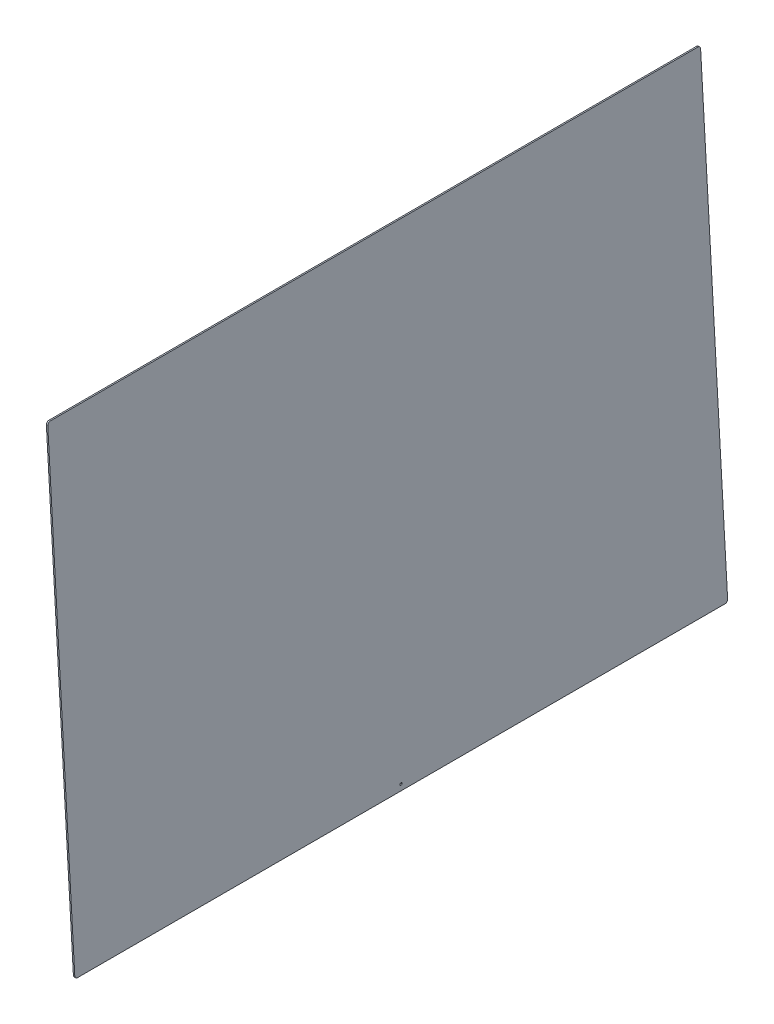
ISO-10303-21;
HEADER;
FILE_DESCRIPTION(('STEP AP214'),'2;1');
FILE_NAME('part.step','',(''),(''),'','','');
FILE_SCHEMA(('AUTOMOTIVE_DESIGN { 1 0 10303 214 1 1 1 1 }'));
ENDSEC;
DATA;
#1=APPLICATION_CONTEXT('core data for automotive mechanical design processes');
#2=APPLICATION_PROTOCOL_DEFINITION('international standard','automotive_design',2000,#1);
#3=PRODUCT_CONTEXT('',#1,'mechanical');
#4=PRODUCT('Part','Part','',(#3));
#5=PRODUCT_RELATED_PRODUCT_CATEGORY('part','',(#4));
#6=PRODUCT_DEFINITION_FORMATION('','',#4);
#7=PRODUCT_DEFINITION_CONTEXT('part definition',#1,'design');
#8=PRODUCT_DEFINITION('design','',#6,#7);
#9=PRODUCT_DEFINITION_SHAPE('','',#8);
#10=(LENGTH_UNIT() NAMED_UNIT(*) SI_UNIT(.MILLI.,.METRE.));
#11=(NAMED_UNIT(*) PLANE_ANGLE_UNIT() SI_UNIT($,.RADIAN.));
#12=(NAMED_UNIT(*) SI_UNIT($,.STERADIAN.) SOLID_ANGLE_UNIT());
#13=UNCERTAINTY_MEASURE_WITH_UNIT(LENGTH_MEASURE(1.E-05),#10,'distance_accuracy_value','');
#14=(GEOMETRIC_REPRESENTATION_CONTEXT(3) GLOBAL_UNCERTAINTY_ASSIGNED_CONTEXT((#13)) GLOBAL_UNIT_ASSIGNED_CONTEXT((#10,
#11,#12)) REPRESENTATION_CONTEXT('',''));
#15=CARTESIAN_POINT('',(0.,0.,0.));
#16=DIRECTION('',(0.,0.,1.));
#17=DIRECTION('',(1.,0.,0.));
#18=AXIS2_PLACEMENT_3D('',#15,#16,#17);
#19=CARTESIAN_POINT('',(-765.372851251011,-171.531638732564,-133.95));
#20=DIRECTION('',(0.998302940921257,0.0582343382204067,0.));
#21=DIRECTION('',(-0.0582343382204067,0.998302940921257,0.));
#22=AXIS2_PLACEMENT_3D('',#19,#20,#21);
#23=PLANE('',#22);
#24=CARTESIAN_POINT('',(-766.246366324317,-156.557094618745,237.3));
#25=DIRECTION('',(0.998302940921257,0.0582343382204067,0.));
#26=DIRECTION('',(-0.0582343382204067,0.998302940921257,0.));
#27=AXIS2_PLACEMENT_3D('',#24,#25,#26);
#28=CIRCLE('',#27,3.);
#29=CARTESIAN_POINT('',(-766.246366324317,-156.557094618745,240.3));
#30=VERTEX_POINT('',#29);
#31=CARTESIAN_POINT('',(-766.071663309656,-159.552003441509,237.3));
#32=VERTEX_POINT('',#31);
#33=EDGE_CURVE('E135',#30,#32,#28,.T.);
#34=ORIENTED_EDGE('',*,*,#33,.F.);
#35=DIRECTION('',(-0.0582343382204077,0.998302940921257,0.));
#36=VECTOR('',#35,1.);
#37=CARTESIAN_POINT('',(-766.246366324317,-156.557094618745,240.3));
#38=LINE('',#37,#36);
#39=CARTESIAN_POINT('',(-797.227034257574,374.540069951364,240.3));
#40=VERTEX_POINT('',#39);
#41=EDGE_CURVE('E116',#30,#40,#38,.T.);
#42=ORIENTED_EDGE('',*,*,#41,.T.);
#43=CARTESIAN_POINT('',(-797.227034257574,374.540069951364,237.3));
#44=DIRECTION('',(-0.998302940921257,-0.0582343382204067,0.));
#45=DIRECTION('',(0.0582343382204067,-0.998302940921257,0.));
#46=AXIS2_PLACEMENT_3D('',#43,#44,#45);
#47=CIRCLE('',#46,3.);
#48=CARTESIAN_POINT('',(-797.401737272235,377.534978774128,237.3));
#49=VERTEX_POINT('',#48);
#50=EDGE_CURVE('E119',#49,#40,#47,.F.);
#51=ORIENTED_EDGE('',*,*,#50,.F.);
#52=DIRECTION('',(0.,0.,1.));
#53=VECTOR('',#52,1.);
#54=CARTESIAN_POINT('',(-797.401737272235,377.534978774127,244.3));
#55=LINE('',#54,#53);
#56=CARTESIAN_POINT('',(-797.401737272235,377.534978774127,-505.2));
#57=VERTEX_POINT('',#56);
#58=EDGE_CURVE('E120',#49,#57,#55,.F.);
#59=ORIENTED_EDGE('',*,*,#58,.T.);
#60=CARTESIAN_POINT('',(-797.227034257574,374.540069951364,-505.2));
#61=DIRECTION('',(0.998302940921257,0.0582343382204067,0.));
#62=DIRECTION('',(-0.0582343382204067,0.998302940921257,0.));
#63=AXIS2_PLACEMENT_3D('',#60,#61,#62);
#64=CIRCLE('',#63,3.);
#65=CARTESIAN_POINT('',(-797.227034257574,374.540069951364,-508.2));
#66=VERTEX_POINT('',#65);
#67=EDGE_CURVE('E89',#66,#57,#64,.T.);
#68=ORIENTED_EDGE('',*,*,#67,.F.);
#69=DIRECTION('',(0.0582343382204077,-0.998302940921257,0.));
#70=VECTOR('',#69,1.);
#71=CARTESIAN_POINT('',(-797.227034257574,374.540069951364,-508.2));
#72=LINE('',#71,#70);
#73=CARTESIAN_POINT('',(-766.246366324317,-156.557094618745,-508.2));
#74=VERTEX_POINT('',#73);
#75=EDGE_CURVE('E82',#66,#74,#72,.T.);
#76=ORIENTED_EDGE('',*,*,#75,.T.);
#77=CARTESIAN_POINT('',(-766.246366324317,-156.557094618745,-505.2));
#78=DIRECTION('',(-0.998302940921257,-0.0582343382204067,0.));
#79=DIRECTION('',(0.0582343382204067,-0.998302940921257,0.));
#80=AXIS2_PLACEMENT_3D('',#77,#78,#79);
#81=CIRCLE('',#80,3.);
#82=CARTESIAN_POINT('',(-766.071663309656,-159.552003441509,-505.2));
#83=VERTEX_POINT('',#82);
#84=EDGE_CURVE('E86',#83,#74,#81,.F.);
#85=ORIENTED_EDGE('',*,*,#84,.F.);
#86=DIRECTION('',(0.,0.,1.));
#87=VECTOR('',#86,1.);
#88=CARTESIAN_POINT('',(-766.071663309656,-159.552003441509,-512.2));
#89=LINE('',#88,#87);
#90=EDGE_CURVE('E77',#83,#32,#89,.T.);
#91=ORIENTED_EDGE('',*,*,#90,.T.);
#92=EDGE_LOOP('',(#34,#42,#51,#59,#68,#76,#85,#91));
#93=FACE_BOUND('',#92,.T.);
#94=CARTESIAN_POINT('',(-766.445680703539,-153.140276689458,-133.95));
#95=DIRECTION('',(-0.998302940921255,-0.058234338220455,0.));
#96=DIRECTION('',(0.058234338220455,-0.998302940921255,0.));
#97=AXIS2_PLACEMENT_3D('',#94,#95,#96);
#98=CIRCLE('',#97,1.69999999999829);
#99=CARTESIAN_POINT('',(-766.346682328565,-154.837391689023,-133.95));
#100=VERTEX_POINT('',#99);
#101=EDGE_CURVE('E19',#100,#100,#98,.F.);
#102=ORIENTED_EDGE('',*,*,#101,.T.);
#103=EDGE_LOOP('',(#102));
#104=FACE_BOUND('',#103,.T.);
#105=ADVANCED_FACE('F16',(#93,#104),#23,.F.);
#106=CARTESIAN_POINT('',(-766.445680703441,-153.140276689452,-133.95));
#107=DIRECTION('',(-0.998302940921255,-0.058234338220455,0.));
#108=DIRECTION('',(0.058234338220455,-0.998302940921255,0.));
#109=AXIS2_PLACEMENT_3D('',#106,#107,#108);
#110=CONICAL_SURFACE('',#109,1.69999999982776,1.04719755122202);
#111=CARTESIAN_POINT('',(-766.186313991273,-153.125146964576,-133.95));
#112=DIRECTION('',(-0.998302940921257,-0.0582343382204067,0.));
#113=DIRECTION('',(0.0582343382204067,-0.998302940921257,0.));
#114=AXIS2_PLACEMENT_3D('',#111,#112,#113);
#115=CIRCLE('',#114,1.25);
#116=CARTESIAN_POINT('',(-766.113521068497,-154.373025640727,-133.95));
#117=VERTEX_POINT('',#116);
#118=EDGE_CURVE('E110',#117,#117,#115,.F.);
#119=ORIENTED_EDGE('',*,*,#118,.T.);
#120=EDGE_LOOP('',(#119));
#121=FACE_BOUND('',#120,.T.);
#122=ORIENTED_EDGE('',*,*,#101,.F.);
#123=EDGE_LOOP('',(#122));
#124=FACE_BOUND('',#123,.T.);
#125=ADVANCED_FACE('F173',(#121,#124),#110,.F.);
#126=CARTESIAN_POINT('',(-764.474378604182,-159.458828500356,-512.2));
#127=DIRECTION('',(-0.0582343382204067,0.998302940921257,0.));
#128=DIRECTION('',(-0.998302940921257,-0.0582343382204067,0.));
#129=AXIS2_PLACEMENT_3D('',#126,#127,#128);
#130=PLANE('',#129);
#131=DIRECTION('',(-0.998302940921257,-0.0582343382204067,0.));
#132=VECTOR('',#131,1.);
#133=CARTESIAN_POINT('',(-764.474378604182,-159.458828500356,-505.2));
#134=LINE('',#133,#132);
#135=CARTESIAN_POINT('',(-764.474378604182,-159.458828500356,-505.2));
#136=VERTEX_POINT('',#135);
#137=EDGE_CURVE('E99',#136,#83,#134,.T.);
#138=ORIENTED_EDGE('',*,*,#137,.F.);
#139=DIRECTION('',(0.,0.,1.));
#140=VECTOR('',#139,1.);
#141=CARTESIAN_POINT('',(-764.474378604182,-159.458828500356,-133.95));
#142=LINE('',#141,#140);
#143=CARTESIAN_POINT('',(-764.474378604182,-159.458828500356,237.3));
#144=VERTEX_POINT('',#143);
#145=EDGE_CURVE('E113',#144,#136,#142,.F.);
#146=ORIENTED_EDGE('',*,*,#145,.F.);
#147=DIRECTION('',(0.998302940921257,0.0582343382204067,0.));
#148=VECTOR('',#147,1.);
#149=CARTESIAN_POINT('',(-764.474378604182,-159.458828500356,237.3));
#150=LINE('',#149,#148);
#151=EDGE_CURVE('E114',#32,#144,#150,.T.);
#152=ORIENTED_EDGE('',*,*,#151,.F.);
#153=ORIENTED_EDGE('',*,*,#90,.F.);
#154=EDGE_LOOP('',(#138,#146,#152,#153));
#155=FACE_BOUND('',#154,.T.);
#156=ADVANCED_FACE('F171',(#155),#130,.F.);
#157=CARTESIAN_POINT('',(-764.649081618843,-156.463919677592,-505.2));
#158=DIRECTION('',(-0.998302940921257,-0.0582343382204067,0.));
#159=DIRECTION('',(0.0582343382204067,-0.998302940921257,0.));
#160=AXIS2_PLACEMENT_3D('',#157,#158,#159);
#161=CYLINDRICAL_SURFACE('',#160,3.);
#162=ORIENTED_EDGE('',*,*,#137,.T.);
#163=ORIENTED_EDGE('',*,*,#84,.T.);
#164=DIRECTION('',(0.998302940921248,0.0582343382205611,0.));
#165=VECTOR('',#164,1.);
#166=CARTESIAN_POINT('',(-766.246366324317,-156.557094618745,-508.2));
#167=LINE('',#166,#165);
#168=CARTESIAN_POINT('',(-764.649081618843,-156.463919677592,-508.2));
#169=VERTEX_POINT('',#168);
#170=EDGE_CURVE('E93',#74,#169,#167,.T.);
#171=ORIENTED_EDGE('',*,*,#170,.T.);
#172=CARTESIAN_POINT('',(-764.649081618843,-156.463919677592,-505.2));
#173=DIRECTION('',(-0.998302940921257,-0.0582343382204067,0.));
#174=DIRECTION('',(0.0582343382204067,-0.998302940921257,0.));
#175=AXIS2_PLACEMENT_3D('',#172,#173,#174);
#176=CIRCLE('',#175,3.);
#177=EDGE_CURVE('E133',#136,#169,#176,.F.);
#178=ORIENTED_EDGE('',*,*,#177,.F.);
#179=EDGE_LOOP('',(#162,#163,#171,#178));
#180=FACE_BOUND('',#179,.T.);
#181=ADVANCED_FACE('F96',(#180),#161,.T.);
#182=CARTESIAN_POINT('',(-796.386795948965,387.611183124493,-508.2));
#183=DIRECTION('',(0.,0.,1.));
#184=DIRECTION('',(1.,0.,0.));
#185=AXIS2_PLACEMENT_3D('',#182,#183,#184);
#186=PLANE('',#185);
#187=ORIENTED_EDGE('',*,*,#75,.F.);
#188=DIRECTION('',(0.998302940921257,0.0582343382204067,0.));
#189=VECTOR('',#188,1.);
#190=CARTESIAN_POINT('',(-795.6297495521,374.633244892517,-508.2));
#191=LINE('',#190,#189);
#192=CARTESIAN_POINT('',(-795.6297495521,374.633244892517,-508.2));
#193=VERTEX_POINT('',#192);
#194=EDGE_CURVE('E104',#193,#66,#191,.F.);
#195=ORIENTED_EDGE('',*,*,#194,.F.);
#196=DIRECTION('',(-0.0582343382204067,0.998302940921257,0.));
#197=VECTOR('',#196,1.);
#198=CARTESIAN_POINT('',(-763.775566545537,-171.438463791411,-508.2));
#199=LINE('',#198,#197);
#200=EDGE_CURVE('E102',#169,#193,#199,.T.);
#201=ORIENTED_EDGE('',*,*,#200,.F.);
#202=ORIENTED_EDGE('',*,*,#170,.F.);
#203=EDGE_LOOP('',(#187,#195,#201,#202));
#204=FACE_BOUND('',#203,.T.);
#205=ADVANCED_FACE('F100',(#204),#186,.F.);
#206=CARTESIAN_POINT('',(-795.6297495521,374.633244892517,-505.2));
#207=DIRECTION('',(0.998302940921257,0.0582343382204067,0.));
#208=DIRECTION('',(-0.0582343382204067,0.998302940921257,0.));
#209=AXIS2_PLACEMENT_3D('',#206,#207,#208);
#210=CYLINDRICAL_SURFACE('',#209,3.);
#211=DIRECTION('',(0.998302940921257,0.0582343382204067,0.));
#212=VECTOR('',#211,1.);
#213=CARTESIAN_POINT('',(-795.804452566761,377.62815371528,-505.2));
#214=LINE('',#213,#212);
#215=CARTESIAN_POINT('',(-795.804452566761,377.62815371528,-505.2));
#216=VERTEX_POINT('',#215);
#217=EDGE_CURVE('E121',#57,#216,#214,.T.);
#218=ORIENTED_EDGE('',*,*,#217,.T.);
#219=CARTESIAN_POINT('',(-795.6297495521,374.633244892517,-505.2));
#220=DIRECTION('',(0.998302940921257,0.0582343382204067,0.));
#221=DIRECTION('',(-0.0582343382204067,0.998302940921257,0.));
#222=AXIS2_PLACEMENT_3D('',#219,#220,#221);
#223=CIRCLE('',#222,3.);
#224=EDGE_CURVE('E130',#193,#216,#223,.T.);
#225=ORIENTED_EDGE('',*,*,#224,.F.);
#226=ORIENTED_EDGE('',*,*,#194,.T.);
#227=ORIENTED_EDGE('',*,*,#67,.T.);
#228=EDGE_LOOP('',(#218,#225,#226,#227));
#229=FACE_BOUND('',#228,.T.);
#230=ADVANCED_FACE('F143',(#229),#210,.T.);
#231=CARTESIAN_POINT('',(-795.804452566761,377.62815371528,244.3));
#232=DIRECTION('',(0.0582343382204067,-0.998302940921257,0.));
#233=DIRECTION('',(0.998302940921257,0.0582343382204067,0.));
#234=AXIS2_PLACEMENT_3D('',#231,#232,#233);
#235=PLANE('',#234);
#236=ORIENTED_EDGE('',*,*,#217,.F.);
#237=ORIENTED_EDGE('',*,*,#58,.F.);
#238=DIRECTION('',(-0.998302940921257,-0.0582343382204067,0.));
#239=VECTOR('',#238,1.);
#240=CARTESIAN_POINT('',(-795.804452566761,377.628153715281,237.3));
#241=LINE('',#240,#239);
#242=CARTESIAN_POINT('',(-795.804452566761,377.62815371528,237.3));
#243=VERTEX_POINT('',#242);
#244=EDGE_CURVE('E140',#243,#49,#241,.T.);
#245=ORIENTED_EDGE('',*,*,#244,.F.);
#246=DIRECTION('',(0.,0.,1.));
#247=VECTOR('',#246,1.);
#248=CARTESIAN_POINT('',(-795.804452566761,377.62815371528,-133.95));
#249=LINE('',#248,#247);
#250=EDGE_CURVE('E129',#216,#243,#249,.T.);
#251=ORIENTED_EDGE('',*,*,#250,.F.);
#252=EDGE_LOOP('',(#236,#237,#245,#251));
#253=FACE_BOUND('',#252,.T.);
#254=ADVANCED_FACE('F147',(#253),#235,.F.);
#255=CARTESIAN_POINT('',(-795.6297495521,374.633244892517,237.3));
#256=DIRECTION('',(-0.998302940921257,-0.0582343382204067,0.));
#257=DIRECTION('',(0.0582343382204067,-0.998302940921257,0.));
#258=AXIS2_PLACEMENT_3D('',#255,#256,#257);
#259=CYLINDRICAL_SURFACE('',#258,3.);
#260=ORIENTED_EDGE('',*,*,#244,.T.);
#261=ORIENTED_EDGE('',*,*,#50,.T.);
#262=DIRECTION('',(0.998302940921244,0.0582343382206343,0.));
#263=VECTOR('',#262,1.);
#264=CARTESIAN_POINT('',(-797.227034257574,374.540069951364,240.3));
#265=LINE('',#264,#263);
#266=CARTESIAN_POINT('',(-795.6297495521,374.633244892517,240.3));
#267=VERTEX_POINT('',#266);
#268=EDGE_CURVE('E118',#40,#267,#265,.T.);
#269=ORIENTED_EDGE('',*,*,#268,.T.);
#270=CARTESIAN_POINT('',(-795.6297495521,374.633244892517,237.3));
#271=DIRECTION('',(-0.998302940921257,-0.0582343382204067,0.));
#272=DIRECTION('',(0.0582343382204067,-0.998302940921257,0.));
#273=AXIS2_PLACEMENT_3D('',#270,#271,#272);
#274=CIRCLE('',#273,3.);
#275=EDGE_CURVE('E126',#243,#267,#274,.F.);
#276=ORIENTED_EDGE('',*,*,#275,.F.);
#277=EDGE_LOOP('',(#260,#261,#269,#276));
#278=FACE_BOUND('',#277,.T.);
#279=ADVANCED_FACE('F168',(#278),#259,.T.);
#280=CARTESIAN_POINT('',(-762.902051472231,-186.41300790523,240.3));
#281=DIRECTION('',(0.,0.,-1.));
#282=DIRECTION('',(-1.,0.,0.));
#283=AXIS2_PLACEMENT_3D('',#280,#281,#282);
#284=PLANE('',#283);
#285=DIRECTION('',(-0.0582343382204067,0.998302940921257,0.));
#286=VECTOR('',#285,1.);
#287=CARTESIAN_POINT('',(-763.775566545537,-171.438463791411,240.3));
#288=LINE('',#287,#286);
#289=CARTESIAN_POINT('',(-764.649081618843,-156.463919677592,240.3));
#290=VERTEX_POINT('',#289);
#291=EDGE_CURVE('E125',#267,#290,#288,.F.);
#292=ORIENTED_EDGE('',*,*,#291,.F.);
#293=ORIENTED_EDGE('',*,*,#268,.F.);
#294=ORIENTED_EDGE('',*,*,#41,.F.);
#295=DIRECTION('',(0.998302940921257,0.0582343382204067,0.));
#296=VECTOR('',#295,1.);
#297=CARTESIAN_POINT('',(-764.649081618843,-156.463919677592,240.3));
#298=LINE('',#297,#296);
#299=EDGE_CURVE('E34',#290,#30,#298,.F.);
#300=ORIENTED_EDGE('',*,*,#299,.F.);
#301=EDGE_LOOP('',(#292,#293,#294,#300));
#302=FACE_BOUND('',#301,.T.);
#303=ADVANCED_FACE('F166',(#302),#284,.F.);
#304=CARTESIAN_POINT('',(-764.649081618843,-156.463919677592,237.3));
#305=DIRECTION('',(0.998302940921257,0.0582343382204067,0.));
#306=DIRECTION('',(-0.0582343382204067,0.998302940921257,0.));
#307=AXIS2_PLACEMENT_3D('',#304,#305,#306);
#308=CYLINDRICAL_SURFACE('',#307,3.);
#309=ORIENTED_EDGE('',*,*,#151,.T.);
#310=CARTESIAN_POINT('',(-764.649081618843,-156.463919677592,237.3));
#311=DIRECTION('',(0.998302940921257,0.0582343382204067,0.));
#312=DIRECTION('',(-0.0582343382204067,0.998302940921257,0.));
#313=AXIS2_PLACEMENT_3D('',#310,#311,#312);
#314=CIRCLE('',#313,3.);
#315=EDGE_CURVE('E25',#290,#144,#314,.T.);
#316=ORIENTED_EDGE('',*,*,#315,.F.);
#317=ORIENTED_EDGE('',*,*,#299,.T.);
#318=ORIENTED_EDGE('',*,*,#33,.T.);
#319=EDGE_LOOP('',(#309,#316,#317,#318));
#320=FACE_BOUND('',#319,.T.);
#321=ADVANCED_FACE('F170',(#320),#308,.T.);
#322=CARTESIAN_POINT('',(-766.445680703526,-153.140276689457,-133.95));
#323=DIRECTION('',(-0.998302940921257,-0.0582343382204067,0.));
#324=DIRECTION('',(0.0582343382204067,-0.998302940921257,0.));
#325=AXIS2_PLACEMENT_3D('',#322,#323,#324);
#326=CYLINDRICAL_SURFACE('',#325,1.25);
#327=CARTESIAN_POINT('',(-764.848395998052,-153.047101748304,-133.95));
#328=DIRECTION('',(-0.998302940921257,-0.0582343382204067,0.));
#329=DIRECTION('',(0.0582343382204067,-0.998302940921257,0.));
#330=AXIS2_PLACEMENT_3D('',#327,#328,#329);
#331=CIRCLE('',#330,1.25);
#332=CARTESIAN_POINT('',(-764.775603075276,-154.294980424456,-133.95));
#333=VERTEX_POINT('',#332);
#334=EDGE_CURVE('E11',#333,#333,#331,.T.);
#335=ORIENTED_EDGE('',*,*,#334,.F.);
#336=EDGE_LOOP('',(#335));
#337=FACE_BOUND('',#336,.T.);
#338=ORIENTED_EDGE('',*,*,#118,.F.);
#339=EDGE_LOOP('',(#338));
#340=FACE_BOUND('',#339,.T.);
#341=ADVANCED_FACE('F183',(#337,#340),#326,.F.);
#342=CARTESIAN_POINT('',(-763.775566545537,-171.438463791411,-133.95));
#343=DIRECTION('',(0.998302940921257,0.0582343382204067,0.));
#344=DIRECTION('',(-0.0582343382204067,0.998302940921257,0.));
#345=AXIS2_PLACEMENT_3D('',#342,#343,#344);
#346=PLANE('',#345);
#347=ORIENTED_EDGE('',*,*,#334,.T.);
#348=EDGE_LOOP('',(#347));
#349=FACE_BOUND('',#348,.T.);
#350=ORIENTED_EDGE('',*,*,#291,.T.);
#351=ORIENTED_EDGE('',*,*,#315,.T.);
#352=ORIENTED_EDGE('',*,*,#145,.T.);
#353=ORIENTED_EDGE('',*,*,#177,.T.);
#354=ORIENTED_EDGE('',*,*,#200,.T.);
#355=ORIENTED_EDGE('',*,*,#224,.T.);
#356=ORIENTED_EDGE('',*,*,#250,.T.);
#357=ORIENTED_EDGE('',*,*,#275,.T.);
#358=EDGE_LOOP('',(#350,#351,#352,#353,#354,#355,#356,#357));
#359=FACE_BOUND('',#358,.T.);
#360=ADVANCED_FACE('F163',(#349,#359),#346,.T.);
#361=CLOSED_SHELL('',(#105,#125,#156,#181,#205,#230,#254,#279,#303,#321,#341,#360));
#362=MANIFOLD_SOLID_BREP('B1',#361);
#363=ADVANCED_BREP_SHAPE_REPRESENTATION('',(#18,#362),#14);
#364=SHAPE_DEFINITION_REPRESENTATION(#9,#363);
ENDSEC;
END-ISO-10303-21;
